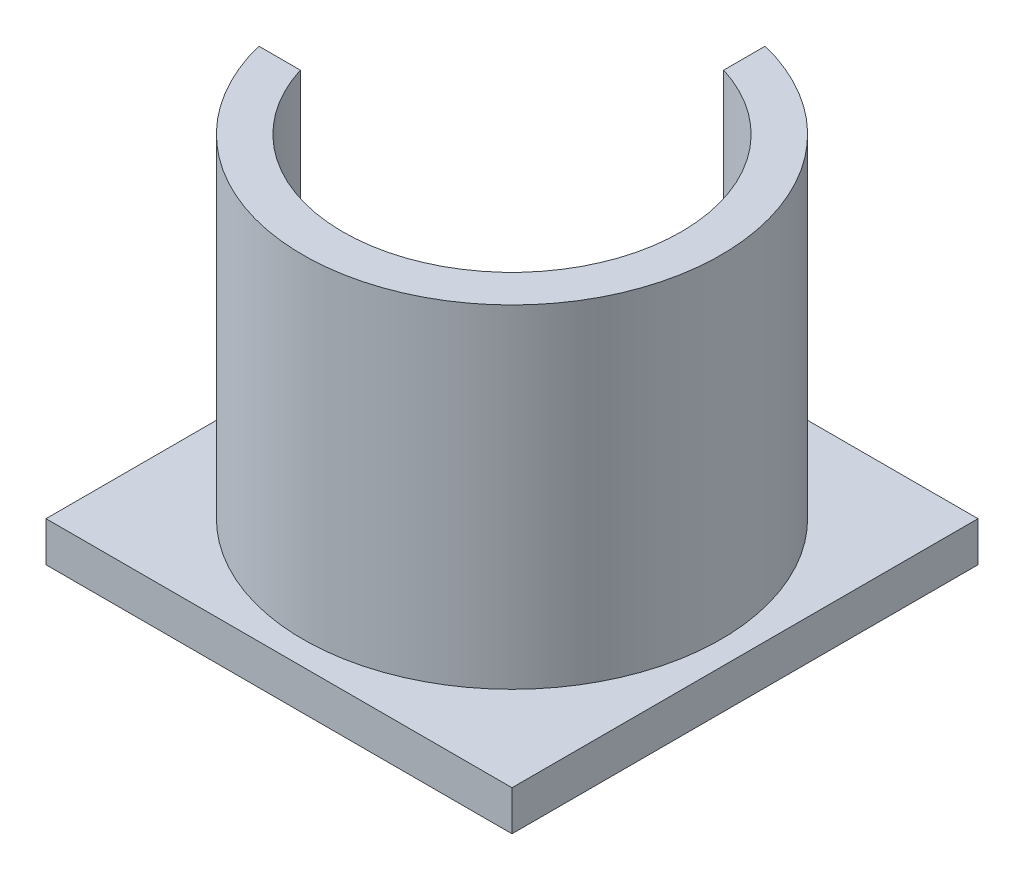
ISO-10303-21;
HEADER;
FILE_DESCRIPTION(('STEP AP214'),'2;1');
FILE_NAME('part.step','',(''),(''),'','','');
FILE_SCHEMA(('AUTOMOTIVE_DESIGN { 1 0 10303 214 1 1 1 1 }'));
ENDSEC;
DATA;
#1=APPLICATION_CONTEXT('core data for automotive mechanical design processes');
#2=APPLICATION_PROTOCOL_DEFINITION('international standard','automotive_design',2000,#1);
#3=PRODUCT_CONTEXT('',#1,'mechanical');
#4=PRODUCT('Part','Part','',(#3));
#5=PRODUCT_RELATED_PRODUCT_CATEGORY('part','',(#4));
#6=PRODUCT_DEFINITION_FORMATION('','',#4);
#7=PRODUCT_DEFINITION_CONTEXT('part definition',#1,'design');
#8=PRODUCT_DEFINITION('design','',#6,#7);
#9=PRODUCT_DEFINITION_SHAPE('','',#8);
#10=(LENGTH_UNIT() NAMED_UNIT(*) SI_UNIT(.MILLI.,.METRE.));
#11=(NAMED_UNIT(*) PLANE_ANGLE_UNIT() SI_UNIT($,.RADIAN.));
#12=(NAMED_UNIT(*) SI_UNIT($,.STERADIAN.) SOLID_ANGLE_UNIT());
#13=UNCERTAINTY_MEASURE_WITH_UNIT(LENGTH_MEASURE(1.E-05),#10,'distance_accuracy_value','');
#14=(GEOMETRIC_REPRESENTATION_CONTEXT(3) GLOBAL_UNCERTAINTY_ASSIGNED_CONTEXT((#13)) GLOBAL_UNIT_ASSIGNED_CONTEXT((#10,
#11,#12)) REPRESENTATION_CONTEXT('',''));
#15=CARTESIAN_POINT('',(0.,0.,0.));
#16=DIRECTION('',(0.,0.,1.));
#17=DIRECTION('',(1.,0.,0.));
#18=AXIS2_PLACEMENT_3D('',#15,#16,#17);
#19=CARTESIAN_POINT('',(0.,3.,0.));
#20=DIRECTION('',(0.,-1.,0.));
#21=DIRECTION('',(0.,0.,-1.));
#22=AXIS2_PLACEMENT_3D('',#19,#20,#21);
#23=PLANE('',#22);
#24=DIRECTION('',(-1.,0.,0.));
#25=VECTOR('',#24,1.);
#26=CARTESIAN_POINT('',(-12.1266314138891,3.,3.7729047896387));
#27=LINE('',#26,#25);
#28=CARTESIAN_POINT('',(-12.1266314138891,3.,3.7729047896387));
#29=VERTEX_POINT('',#28);
#30=CARTESIAN_POINT('',(-15.2399209134536,3.,3.7729047896387));
#31=VERTEX_POINT('',#30);
#32=EDGE_CURVE('E190',#29,#31,#27,.T.);
#33=ORIENTED_EDGE('',*,*,#32,.F.);
#34=CARTESIAN_POINT('',(0.,3.,0.));
#35=DIRECTION('',(0.,1.,0.));
#36=DIRECTION('',(0.,0.,1.));
#37=AXIS2_PLACEMENT_3D('',#34,#35,#36);
#38=CIRCLE('',#37,12.7);
#39=CARTESIAN_POINT('',(3.7729047896387,3.,-12.1266314138891));
#40=VERTEX_POINT('',#39);
#41=EDGE_CURVE('E182',#29,#40,#38,.T.);
#42=ORIENTED_EDGE('',*,*,#41,.T.);
#43=DIRECTION('',(0.,0.,-1.));
#44=VECTOR('',#43,1.);
#45=CARTESIAN_POINT('',(3.7729047896387,3.,-12.1266314138891));
#46=LINE('',#45,#44);
#47=CARTESIAN_POINT('',(3.77290478963871,3.,-15.2399209134536));
#48=VERTEX_POINT('',#47);
#49=EDGE_CURVE('E56',#40,#48,#46,.T.);
#50=ORIENTED_EDGE('',*,*,#49,.T.);
#51=CARTESIAN_POINT('',(0.,3.,0.));
#52=DIRECTION('',(0.,1.,0.));
#53=DIRECTION('',(0.,0.,1.));
#54=AXIS2_PLACEMENT_3D('',#51,#52,#53);
#55=CIRCLE('',#54,15.7);
#56=EDGE_CURVE('E187',#31,#48,#55,.T.);
#57=ORIENTED_EDGE('',*,*,#56,.F.);
#58=EDGE_LOOP('',(#33,#42,#50,#57));
#59=FACE_BOUND('',#58,.T.);
#60=DIRECTION('',(-0.707106781186544,0.,-0.707106781186551));
#61=VECTOR('',#60,1.);
#62=CARTESIAN_POINT('',(-2.75771644662755,3.,2.75771644662752));
#63=LINE('',#62,#61);
#64=CARTESIAN_POINT('',(-2.75771644662755,3.,2.75771644662752));
#65=VERTEX_POINT('',#64);
#66=CARTESIAN_POINT('',(-17.5,3.,-11.9845671067451));
#67=VERTEX_POINT('',#66);
#68=EDGE_CURVE('E205',#65,#67,#63,.T.);
#69=ORIENTED_EDGE('',*,*,#68,.T.);
#70=DIRECTION('',(0.,0.,1.));
#71=VECTOR('',#70,1.);
#72=CARTESIAN_POINT('',(-17.5,3.,17.5));
#73=LINE('',#72,#71);
#74=CARTESIAN_POINT('',(-17.5,3.,17.5));
#75=VERTEX_POINT('',#74);
#76=EDGE_CURVE('E134',#67,#75,#73,.T.);
#77=ORIENTED_EDGE('',*,*,#76,.T.);
#78=DIRECTION('',(1.,0.,0.));
#79=VECTOR('',#78,1.);
#80=CARTESIAN_POINT('',(-17.5,3.,17.5));
#81=LINE('',#80,#79);
#82=CARTESIAN_POINT('',(17.5,3.,17.5));
#83=VERTEX_POINT('',#82);
#84=EDGE_CURVE('E172',#75,#83,#81,.T.);
#85=ORIENTED_EDGE('',*,*,#84,.T.);
#86=DIRECTION('',(0.,0.,-1.));
#87=VECTOR('',#86,1.);
#88=CARTESIAN_POINT('',(17.5,3.,17.5));
#89=LINE('',#88,#87);
#90=CARTESIAN_POINT('',(17.5,3.,-17.5));
#91=VERTEX_POINT('',#90);
#92=EDGE_CURVE('E161',#83,#91,#89,.T.);
#93=ORIENTED_EDGE('',*,*,#92,.T.);
#94=DIRECTION('',(-1.,0.,0.));
#95=VECTOR('',#94,1.);
#96=CARTESIAN_POINT('',(-17.5,3.,-17.5));
#97=LINE('',#96,#95);
#98=CARTESIAN_POINT('',(-11.9845671067448,3.,-17.5));
#99=VERTEX_POINT('',#98);
#100=EDGE_CURVE('E146',#91,#99,#97,.T.);
#101=ORIENTED_EDGE('',*,*,#100,.T.);
#102=DIRECTION('',(-0.707106781186544,0.,-0.707106781186551));
#103=VECTOR('',#102,1.);
#104=CARTESIAN_POINT('',(2.75771644662755,3.,-2.75771644662752));
#105=LINE('',#104,#103);
#106=CARTESIAN_POINT('',(2.75771644662755,3.,-2.75771644662752));
#107=VERTEX_POINT('',#106);
#108=EDGE_CURVE('E209',#107,#99,#105,.T.);
#109=ORIENTED_EDGE('',*,*,#108,.F.);
#110=CARTESIAN_POINT('',(0.,3.,0.));
#111=DIRECTION('',(0.,1.,0.));
#112=DIRECTION('',(0.,0.,1.));
#113=AXIS2_PLACEMENT_3D('',#110,#111,#112);
#114=CIRCLE('',#113,3.9);
#115=EDGE_CURVE('E126',#65,#107,#114,.T.);
#116=ORIENTED_EDGE('',*,*,#115,.F.);
#117=EDGE_LOOP('',(#69,#77,#85,#93,#101,#109,#116));
#118=FACE_BOUND('',#117,.T.);
#119=ADVANCED_FACE('F33',(#59,#118),#23,.F.);
#120=CARTESIAN_POINT('',(-17.5,3.,17.5));
#121=DIRECTION('',(1.,0.,0.));
#122=DIRECTION('',(0.,0.,-1.));
#123=AXIS2_PLACEMENT_3D('',#120,#121,#122);
#124=PLANE('',#123);
#125=DIRECTION('',(0.,1.,0.));
#126=VECTOR('',#125,1.);
#127=CARTESIAN_POINT('',(-17.5,-0.00100000000000013,-11.9845671067451));
#128=LINE('',#127,#126);
#129=CARTESIAN_POINT('',(-17.5,0.,-11.9845671067451));
#130=VERTEX_POINT('',#129);
#131=EDGE_CURVE('E120',#130,#67,#128,.T.);
#132=ORIENTED_EDGE('',*,*,#131,.F.);
#133=DIRECTION('',(0.,0.,1.));
#134=VECTOR('',#133,1.);
#135=CARTESIAN_POINT('',(-17.5,0.,17.5));
#136=LINE('',#135,#134);
#137=CARTESIAN_POINT('',(-17.5,0.,17.5));
#138=VERTEX_POINT('',#137);
#139=EDGE_CURVE('E132',#130,#138,#136,.T.);
#140=ORIENTED_EDGE('',*,*,#139,.T.);
#141=DIRECTION('',(0.,-1.,0.));
#142=VECTOR('',#141,1.);
#143=CARTESIAN_POINT('',(-17.5,3.,17.5));
#144=LINE('',#143,#142);
#145=EDGE_CURVE('E11',#75,#138,#144,.T.);
#146=ORIENTED_EDGE('',*,*,#145,.F.);
#147=ORIENTED_EDGE('',*,*,#76,.F.);
#148=EDGE_LOOP('',(#132,#140,#146,#147));
#149=FACE_BOUND('',#148,.T.);
#150=ADVANCED_FACE('F35',(#149),#124,.F.);
#151=CARTESIAN_POINT('',(0.,0.,0.));
#152=DIRECTION('',(0.,-1.,0.));
#153=DIRECTION('',(0.,0.,-1.));
#154=AXIS2_PLACEMENT_3D('',#151,#152,#153);
#155=PLANE('',#154);
#156=ORIENTED_EDGE('',*,*,#139,.F.);
#157=DIRECTION('',(-0.707106781186544,0.,-0.707106781186551));
#158=VECTOR('',#157,1.);
#159=CARTESIAN_POINT('',(-2.75771644662755,0.,2.75771644662752));
#160=LINE('',#159,#158);
#161=CARTESIAN_POINT('',(-2.75771644662755,0.,2.75771644662752));
#162=VERTEX_POINT('',#161);
#163=EDGE_CURVE('E116',#162,#130,#160,.T.);
#164=ORIENTED_EDGE('',*,*,#163,.F.);
#165=CARTESIAN_POINT('',(0.,0.,0.));
#166=DIRECTION('',(0.,-1.,0.));
#167=DIRECTION('',(0.,0.,-1.));
#168=AXIS2_PLACEMENT_3D('',#165,#166,#167);
#169=CIRCLE('',#168,3.9);
#170=CARTESIAN_POINT('',(2.75771644662755,0.,-2.75771644662752));
#171=VERTEX_POINT('',#170);
#172=EDGE_CURVE('E127',#162,#171,#169,.F.);
#173=ORIENTED_EDGE('',*,*,#172,.T.);
#174=DIRECTION('',(-0.707106781186544,0.,-0.707106781186551));
#175=VECTOR('',#174,1.);
#176=CARTESIAN_POINT('',(2.75771644662755,0.,-2.75771644662752));
#177=LINE('',#176,#175);
#178=CARTESIAN_POINT('',(-11.9845671067448,0.,-17.5));
#179=VERTEX_POINT('',#178);
#180=EDGE_CURVE('E165',#171,#179,#177,.T.);
#181=ORIENTED_EDGE('',*,*,#180,.T.);
#182=DIRECTION('',(-1.,0.,0.));
#183=VECTOR('',#182,1.);
#184=CARTESIAN_POINT('',(-17.5,0.,-17.5));
#185=LINE('',#184,#183);
#186=CARTESIAN_POINT('',(17.5,0.,-17.5));
#187=VERTEX_POINT('',#186);
#188=EDGE_CURVE('E150',#187,#179,#185,.T.);
#189=ORIENTED_EDGE('',*,*,#188,.F.);
#190=DIRECTION('',(0.,0.,-1.));
#191=VECTOR('',#190,1.);
#192=CARTESIAN_POINT('',(17.5,0.,17.5));
#193=LINE('',#192,#191);
#194=CARTESIAN_POINT('',(17.5,0.,17.5));
#195=VERTEX_POINT('',#194);
#196=EDGE_CURVE('E141',#195,#187,#193,.T.);
#197=ORIENTED_EDGE('',*,*,#196,.F.);
#198=DIRECTION('',(1.,0.,0.));
#199=VECTOR('',#198,1.);
#200=CARTESIAN_POINT('',(-17.5,0.,17.5));
#201=LINE('',#200,#199);
#202=EDGE_CURVE('E138',#138,#195,#201,.T.);
#203=ORIENTED_EDGE('',*,*,#202,.F.);
#204=EDGE_LOOP('',(#156,#164,#173,#181,#189,#197,#203));
#205=FACE_BOUND('',#204,.T.);
#206=ADVANCED_FACE('F136',(#205),#155,.T.);
#207=CARTESIAN_POINT('',(-17.5,3.,17.5));
#208=DIRECTION('',(0.,0.,-1.));
#209=DIRECTION('',(-1.,0.,0.));
#210=AXIS2_PLACEMENT_3D('',#207,#208,#209);
#211=PLANE('',#210);
#212=ORIENTED_EDGE('',*,*,#202,.T.);
#213=DIRECTION('',(0.,-1.,0.));
#214=VECTOR('',#213,1.);
#215=CARTESIAN_POINT('',(17.5,3.,17.5));
#216=LINE('',#215,#214);
#217=EDGE_CURVE('E41',#83,#195,#216,.T.);
#218=ORIENTED_EDGE('',*,*,#217,.F.);
#219=ORIENTED_EDGE('',*,*,#84,.F.);
#220=ORIENTED_EDGE('',*,*,#145,.T.);
#221=EDGE_LOOP('',(#212,#218,#219,#220));
#222=FACE_BOUND('',#221,.T.);
#223=ADVANCED_FACE('F218',(#222),#211,.F.);
#224=CARTESIAN_POINT('',(17.5,3.,17.5));
#225=DIRECTION('',(-1.,0.,0.));
#226=DIRECTION('',(0.,0.,1.));
#227=AXIS2_PLACEMENT_3D('',#224,#225,#226);
#228=PLANE('',#227);
#229=ORIENTED_EDGE('',*,*,#196,.T.);
#230=DIRECTION('',(0.,-1.,0.));
#231=VECTOR('',#230,1.);
#232=CARTESIAN_POINT('',(17.5,3.,-17.5));
#233=LINE('',#232,#231);
#234=EDGE_CURVE('E153',#91,#187,#233,.T.);
#235=ORIENTED_EDGE('',*,*,#234,.F.);
#236=ORIENTED_EDGE('',*,*,#92,.F.);
#237=ORIENTED_EDGE('',*,*,#217,.T.);
#238=EDGE_LOOP('',(#229,#235,#236,#237));
#239=FACE_BOUND('',#238,.T.);
#240=ADVANCED_FACE('F159',(#239),#228,.F.);
#241=CARTESIAN_POINT('',(-17.5,3.,-17.5));
#242=DIRECTION('',(0.,0.,1.));
#243=DIRECTION('',(1.,0.,0.));
#244=AXIS2_PLACEMENT_3D('',#241,#242,#243);
#245=PLANE('',#244);
#246=ORIENTED_EDGE('',*,*,#188,.T.);
#247=DIRECTION('',(0.,1.,0.));
#248=VECTOR('',#247,1.);
#249=CARTESIAN_POINT('',(-11.9845671067448,-0.00100000000000013,-17.5));
#250=LINE('',#249,#248);
#251=EDGE_CURVE('E48',#179,#99,#250,.T.);
#252=ORIENTED_EDGE('',*,*,#251,.T.);
#253=ORIENTED_EDGE('',*,*,#100,.F.);
#254=ORIENTED_EDGE('',*,*,#234,.T.);
#255=EDGE_LOOP('',(#246,#252,#253,#254));
#256=FACE_BOUND('',#255,.T.);
#257=ADVANCED_FACE('F167',(#256),#245,.F.);
#258=CARTESIAN_POINT('',(-12.1266314138891,28.,3.7729047896387));
#259=DIRECTION('',(0.,0.,1.));
#260=DIRECTION('',(1.,0.,0.));
#261=AXIS2_PLACEMENT_3D('',#258,#259,#260);
#262=PLANE('',#261);
#263=ORIENTED_EDGE('',*,*,#32,.T.);
#264=DIRECTION('',(0.,-1.,0.));
#265=VECTOR('',#264,1.);
#266=CARTESIAN_POINT('',(-15.2399209134536,28.,3.7729047896387));
#267=LINE('',#266,#265);
#268=CARTESIAN_POINT('',(-15.2399209134536,28.,3.7729047896387));
#269=VERTEX_POINT('',#268);
#270=EDGE_CURVE('E139',#269,#31,#267,.T.);
#271=ORIENTED_EDGE('',*,*,#270,.F.);
#272=DIRECTION('',(-1.,0.,0.));
#273=VECTOR('',#272,1.);
#274=CARTESIAN_POINT('',(-12.1266314138891,28.,3.7729047896387));
#275=LINE('',#274,#273);
#276=CARTESIAN_POINT('',(-12.1266314138891,28.,3.7729047896387));
#277=VERTEX_POINT('',#276);
#278=EDGE_CURVE('E185',#277,#269,#275,.T.);
#279=ORIENTED_EDGE('',*,*,#278,.F.);
#280=DIRECTION('',(0.,-1.,0.));
#281=VECTOR('',#280,1.);
#282=CARTESIAN_POINT('',(-12.1266314138891,28.,3.7729047896387));
#283=LINE('',#282,#281);
#284=EDGE_CURVE('E179',#277,#29,#283,.T.);
#285=ORIENTED_EDGE('',*,*,#284,.T.);
#286=EDGE_LOOP('',(#263,#271,#279,#285));
#287=FACE_BOUND('',#286,.T.);
#288=ADVANCED_FACE('F234',(#287),#262,.F.);
#289=CARTESIAN_POINT('',(0.,28.,0.));
#290=DIRECTION('',(0.,-1.,0.));
#291=DIRECTION('',(0.,0.,-1.));
#292=AXIS2_PLACEMENT_3D('',#289,#290,#291);
#293=CYLINDRICAL_SURFACE('',#292,15.7);
#294=ORIENTED_EDGE('',*,*,#56,.T.);
#295=DIRECTION('',(0.,-1.,0.));
#296=VECTOR('',#295,1.);
#297=CARTESIAN_POINT('',(3.77290478963871,28.,-15.2399209134536));
#298=LINE('',#297,#296);
#299=CARTESIAN_POINT('',(3.77290478963871,28.,-15.2399209134536));
#300=VERTEX_POINT('',#299);
#301=EDGE_CURVE('E143',#300,#48,#298,.T.);
#302=ORIENTED_EDGE('',*,*,#301,.F.);
#303=CARTESIAN_POINT('',(0.,28.,0.));
#304=DIRECTION('',(0.,1.,0.));
#305=DIRECTION('',(0.,0.,1.));
#306=AXIS2_PLACEMENT_3D('',#303,#304,#305);
#307=CIRCLE('',#306,15.7);
#308=EDGE_CURVE('E198',#269,#300,#307,.T.);
#309=ORIENTED_EDGE('',*,*,#308,.F.);
#310=ORIENTED_EDGE('',*,*,#270,.T.);
#311=EDGE_LOOP('',(#294,#302,#309,#310));
#312=FACE_BOUND('',#311,.T.);
#313=ADVANCED_FACE('F241',(#312),#293,.T.);
#314=CARTESIAN_POINT('',(3.7729047896387,28.,-12.1266314138891));
#315=DIRECTION('',(-1.,0.,0.));
#316=DIRECTION('',(0.,0.,1.));
#317=AXIS2_PLACEMENT_3D('',#314,#315,#316);
#318=PLANE('',#317);
#319=ORIENTED_EDGE('',*,*,#49,.F.);
#320=DIRECTION('',(0.,-1.,0.));
#321=VECTOR('',#320,1.);
#322=CARTESIAN_POINT('',(3.7729047896387,28.,-12.1266314138891));
#323=LINE('',#322,#321);
#324=CARTESIAN_POINT('',(3.7729047896387,28.,-12.1266314138891));
#325=VERTEX_POINT('',#324);
#326=EDGE_CURVE('E177',#325,#40,#323,.T.);
#327=ORIENTED_EDGE('',*,*,#326,.F.);
#328=DIRECTION('',(0.,0.,-1.));
#329=VECTOR('',#328,1.);
#330=CARTESIAN_POINT('',(3.7729047896387,28.,-12.1266314138891));
#331=LINE('',#330,#329);
#332=EDGE_CURVE('E195',#325,#300,#331,.T.);
#333=ORIENTED_EDGE('',*,*,#332,.T.);
#334=ORIENTED_EDGE('',*,*,#301,.T.);
#335=EDGE_LOOP('',(#319,#327,#333,#334));
#336=FACE_BOUND('',#335,.T.);
#337=ADVANCED_FACE('F246',(#336),#318,.T.);
#338=CARTESIAN_POINT('',(0.,28.,0.));
#339=DIRECTION('',(0.,-1.,0.));
#340=DIRECTION('',(0.,0.,-1.));
#341=AXIS2_PLACEMENT_3D('',#338,#339,#340);
#342=CYLINDRICAL_SURFACE('',#341,12.7);
#343=ORIENTED_EDGE('',*,*,#41,.F.);
#344=ORIENTED_EDGE('',*,*,#284,.F.);
#345=CARTESIAN_POINT('',(0.,28.,0.));
#346=DIRECTION('',(0.,1.,0.));
#347=DIRECTION('',(0.,0.,1.));
#348=AXIS2_PLACEMENT_3D('',#345,#346,#347);
#349=CIRCLE('',#348,12.7);
#350=EDGE_CURVE('E181',#277,#325,#349,.T.);
#351=ORIENTED_EDGE('',*,*,#350,.T.);
#352=ORIENTED_EDGE('',*,*,#326,.T.);
#353=EDGE_LOOP('',(#343,#344,#351,#352));
#354=FACE_BOUND('',#353,.T.);
#355=ADVANCED_FACE('F258',(#354),#342,.F.);
#356=CARTESIAN_POINT('',(0.,28.,0.));
#357=DIRECTION('',(0.,1.,0.));
#358=DIRECTION('',(0.,0.,1.));
#359=AXIS2_PLACEMENT_3D('',#356,#357,#358);
#360=PLANE('',#359);
#361=ORIENTED_EDGE('',*,*,#278,.T.);
#362=ORIENTED_EDGE('',*,*,#308,.T.);
#363=ORIENTED_EDGE('',*,*,#332,.F.);
#364=ORIENTED_EDGE('',*,*,#350,.F.);
#365=EDGE_LOOP('',(#361,#362,#363,#364));
#366=FACE_BOUND('',#365,.T.);
#367=ADVANCED_FACE('F256',(#366),#360,.T.);
#368=CARTESIAN_POINT('',(0.,-0.00100000000000013,0.));
#369=DIRECTION('',(0.,1.,0.));
#370=DIRECTION('',(0.,0.,1.));
#371=AXIS2_PLACEMENT_3D('',#368,#369,#370);
#372=CYLINDRICAL_SURFACE('',#371,3.9);
#373=DIRECTION('',(0.,1.,0.));
#374=VECTOR('',#373,1.);
#375=CARTESIAN_POINT('',(-2.75771644662755,-0.00100000000000013,2.75771644662752));
#376=LINE('',#375,#374);
#377=EDGE_CURVE('E122',#162,#65,#376,.T.);
#378=ORIENTED_EDGE('',*,*,#377,.T.);
#379=ORIENTED_EDGE('',*,*,#115,.T.);
#380=DIRECTION('',(0.,1.,0.));
#381=VECTOR('',#380,1.);
#382=CARTESIAN_POINT('',(2.75771644662755,-0.00100000000000013,-2.75771644662752));
#383=LINE('',#382,#381);
#384=EDGE_CURVE('E203',#171,#107,#383,.T.);
#385=ORIENTED_EDGE('',*,*,#384,.F.);
#386=ORIENTED_EDGE('',*,*,#172,.F.);
#387=EDGE_LOOP('',(#378,#379,#385,#386));
#388=FACE_BOUND('',#387,.T.);
#389=ADVANCED_FACE('F215',(#388),#372,.F.);
#390=CARTESIAN_POINT('',(-2.75771644662755,-0.00100000000000013,2.75771644662752));
#391=DIRECTION('',(0.707106781186551,0.,-0.707106781186544));
#392=DIRECTION('',(-0.707106781186544,0.,-0.707106781186551));
#393=AXIS2_PLACEMENT_3D('',#390,#391,#392);
#394=PLANE('',#393);
#395=ORIENTED_EDGE('',*,*,#163,.T.);
#396=ORIENTED_EDGE('',*,*,#131,.T.);
#397=ORIENTED_EDGE('',*,*,#68,.F.);
#398=ORIENTED_EDGE('',*,*,#377,.F.);
#399=EDGE_LOOP('',(#395,#396,#397,#398));
#400=FACE_BOUND('',#399,.T.);
#401=ADVANCED_FACE('F118',(#400),#394,.T.);
#402=CARTESIAN_POINT('',(2.75771644662755,-0.00100000000000013,-2.75771644662752));
#403=DIRECTION('',(0.707106781186551,0.,-0.707106781186544));
#404=DIRECTION('',(-0.707106781186544,0.,-0.707106781186551));
#405=AXIS2_PLACEMENT_3D('',#402,#403,#404);
#406=PLANE('',#405);
#407=ORIENTED_EDGE('',*,*,#384,.T.);
#408=ORIENTED_EDGE('',*,*,#108,.T.);
#409=ORIENTED_EDGE('',*,*,#251,.F.);
#410=ORIENTED_EDGE('',*,*,#180,.F.);
#411=EDGE_LOOP('',(#407,#408,#409,#410));
#412=FACE_BOUND('',#411,.T.);
#413=ADVANCED_FACE('F217',(#412),#406,.F.);
#414=CLOSED_SHELL('',(#119,#150,#206,#223,#240,#257,#288,#313,#337,#355,#367,#389,#401,#413));
#415=MANIFOLD_SOLID_BREP('B2',#414);
#416=ADVANCED_BREP_SHAPE_REPRESENTATION('',(#18,#415),#14);
#417=SHAPE_DEFINITION_REPRESENTATION(#9,#416);
ENDSEC;
END-ISO-10303-21;
